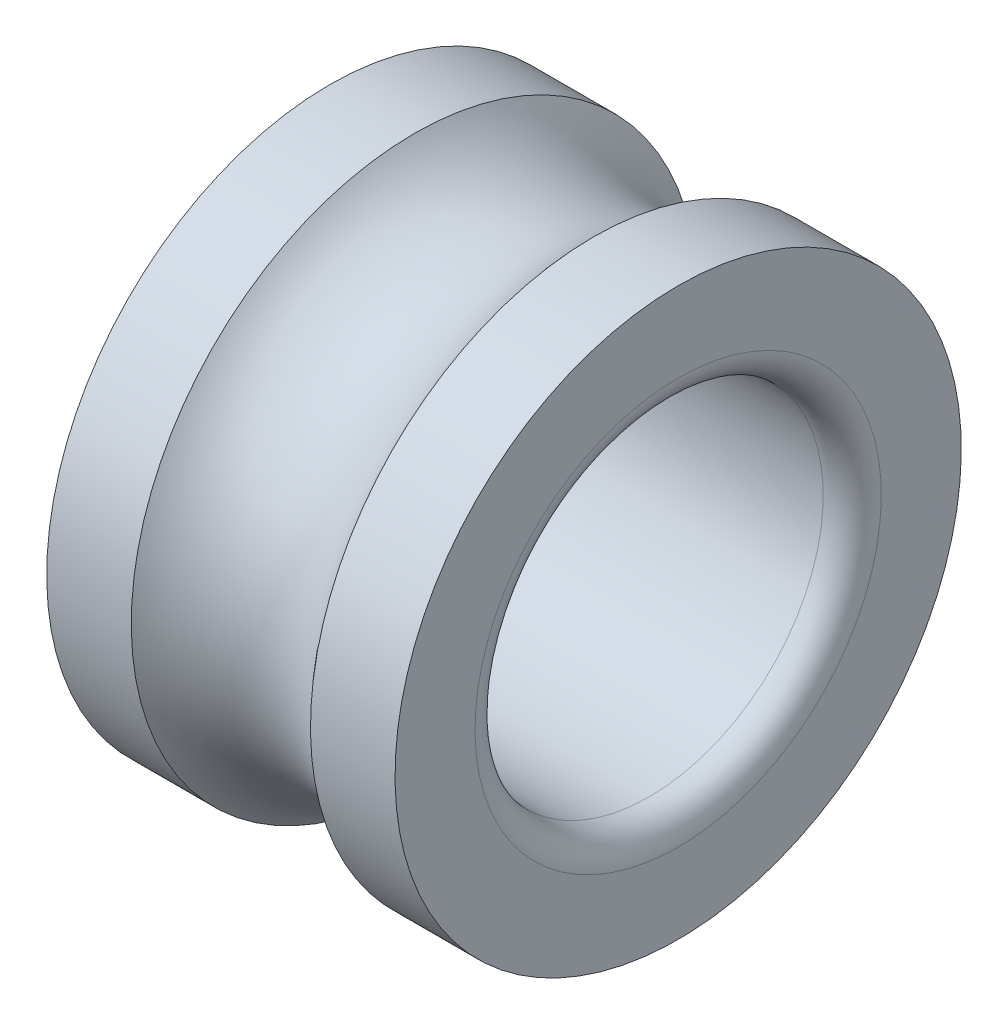
ISO-10303-21;
HEADER;
FILE_DESCRIPTION(('STEP AP214'),'2;1');
FILE_NAME('part.step','',(''),(''),'','','');
FILE_SCHEMA(('AUTOMOTIVE_DESIGN { 1 0 10303 214 1 1 1 1 }'));
ENDSEC;
DATA;
#1=APPLICATION_CONTEXT('core data for automotive mechanical design processes');
#2=APPLICATION_PROTOCOL_DEFINITION('international standard','automotive_design',2000,#1);
#3=PRODUCT_CONTEXT('',#1,'mechanical');
#4=PRODUCT('Part','Part','',(#3));
#5=PRODUCT_RELATED_PRODUCT_CATEGORY('part','',(#4));
#6=PRODUCT_DEFINITION_FORMATION('','',#4);
#7=PRODUCT_DEFINITION_CONTEXT('part definition',#1,'design');
#8=PRODUCT_DEFINITION('design','',#6,#7);
#9=PRODUCT_DEFINITION_SHAPE('','',#8);
#10=(LENGTH_UNIT() NAMED_UNIT(*) SI_UNIT(.MILLI.,.METRE.));
#11=(NAMED_UNIT(*) PLANE_ANGLE_UNIT() SI_UNIT($,.RADIAN.));
#12=(NAMED_UNIT(*) SI_UNIT($,.STERADIAN.) SOLID_ANGLE_UNIT());
#13=UNCERTAINTY_MEASURE_WITH_UNIT(LENGTH_MEASURE(1.E-05),#10,'distance_accuracy_value','');
#14=(GEOMETRIC_REPRESENTATION_CONTEXT(3) GLOBAL_UNCERTAINTY_ASSIGNED_CONTEXT((#13)) GLOBAL_UNIT_ASSIGNED_CONTEXT((#10,
#11,#12)) REPRESENTATION_CONTEXT('',''));
#15=CARTESIAN_POINT('',(0.,0.,0.));
#16=DIRECTION('',(0.,0.,1.));
#17=DIRECTION('',(1.,0.,0.));
#18=AXIS2_PLACEMENT_3D('',#15,#16,#17);
#19=CARTESIAN_POINT('',(10.5433677461966,0.,0.));
#20=DIRECTION('',(-1.,0.,0.));
#21=DIRECTION('',(0.,1.,0.));
#22=AXIS2_PLACEMENT_3D('',#19,#20,#21);
#23=CYLINDRICAL_SURFACE('',#22,9.755);
#24=CARTESIAN_POINT('',(9.08673549239322,0.,0.));
#25=DIRECTION('',(1.,0.,0.));
#26=DIRECTION('',(0.,1.,0.));
#27=AXIS2_PLACEMENT_3D('',#24,#25,#26);
#28=CIRCLE('',#27,9.755);
#29=CARTESIAN_POINT('',(9.08673549239322,9.755,0.));
#30=VERTEX_POINT('',#29);
#31=EDGE_CURVE('E11',#30,#30,#28,.T.);
#32=ORIENTED_EDGE('',*,*,#31,.T.);
#33=EDGE_LOOP('',(#32));
#34=FACE_BOUND('',#33,.T.);
#35=CARTESIAN_POINT('',(12.,0.,0.));
#36=DIRECTION('',(1.,0.,0.));
#37=DIRECTION('',(0.,1.,0.));
#38=AXIS2_PLACEMENT_3D('',#35,#36,#37);
#39=CIRCLE('',#38,9.755);
#40=CARTESIAN_POINT('',(12.,9.755,0.));
#41=VERTEX_POINT('',#40);
#42=EDGE_CURVE('E50',#41,#41,#39,.T.);
#43=ORIENTED_EDGE('',*,*,#42,.F.);
#44=EDGE_LOOP('',(#43));
#45=FACE_BOUND('',#44,.T.);
#46=ADVANCED_FACE('F16',(#34,#45),#23,.T.);
#47=CARTESIAN_POINT('',(6.,0.,0.));
#48=DIRECTION('',(1.,0.,0.));
#49=DIRECTION('',(0.,0.,-1.));
#50=AXIS2_PLACEMENT_3D('',#47,#48,#49);
#51=TOROIDAL_SURFACE('',#50,12.25,3.969);
#52=CARTESIAN_POINT('',(2.91326450760678,0.,0.));
#53=DIRECTION('',(1.,0.,0.));
#54=DIRECTION('',(0.,1.,0.));
#55=AXIS2_PLACEMENT_3D('',#52,#53,#54);
#56=CIRCLE('',#55,9.755);
#57=CARTESIAN_POINT('',(2.91326450760678,9.755,0.));
#58=VERTEX_POINT('',#57);
#59=EDGE_CURVE('E20',#58,#58,#56,.T.);
#60=ORIENTED_EDGE('',*,*,#59,.T.);
#61=EDGE_LOOP('',(#60));
#62=FACE_BOUND('',#61,.T.);
#63=ORIENTED_EDGE('',*,*,#31,.F.);
#64=EDGE_LOOP('',(#63));
#65=FACE_BOUND('',#64,.T.);
#66=ADVANCED_FACE('F95',(#62,#65),#51,.F.);
#67=CARTESIAN_POINT('',(1.45663225380339,0.,0.));
#68=DIRECTION('',(-1.,0.,0.));
#69=DIRECTION('',(0.,1.,0.));
#70=AXIS2_PLACEMENT_3D('',#67,#68,#69);
#71=CYLINDRICAL_SURFACE('',#70,9.755);
#72=CARTESIAN_POINT('',(0.,0.,0.));
#73=DIRECTION('',(1.,0.,0.));
#74=DIRECTION('',(0.,1.,0.));
#75=AXIS2_PLACEMENT_3D('',#72,#73,#74);
#76=CIRCLE('',#75,9.755);
#77=CARTESIAN_POINT('',(0.,9.755,0.));
#78=VERTEX_POINT('',#77);
#79=EDGE_CURVE('E56',#78,#78,#76,.T.);
#80=ORIENTED_EDGE('',*,*,#79,.T.);
#81=EDGE_LOOP('',(#80));
#82=FACE_BOUND('',#81,.T.);
#83=ORIENTED_EDGE('',*,*,#59,.F.);
#84=EDGE_LOOP('',(#83));
#85=FACE_BOUND('',#84,.T.);
#86=ADVANCED_FACE('F18',(#82,#85),#71,.T.);
#87=CARTESIAN_POINT('',(0.,8.3775,0.));
#88=DIRECTION('',(-1.,0.,0.));
#89=DIRECTION('',(0.,-1.,0.));
#90=AXIS2_PLACEMENT_3D('',#87,#88,#89);
#91=PLANE('',#90);
#92=CARTESIAN_POINT('',(0.,0.,0.));
#93=DIRECTION('',(1.,0.,0.));
#94=DIRECTION('',(0.,1.,0.));
#95=AXIS2_PLACEMENT_3D('',#92,#93,#94);
#96=CIRCLE('',#95,7.);
#97=CARTESIAN_POINT('',(0.,7.,0.));
#98=VERTEX_POINT('',#97);
#99=EDGE_CURVE('E60',#98,#98,#96,.T.);
#100=ORIENTED_EDGE('',*,*,#99,.T.);
#101=EDGE_LOOP('',(#100));
#102=FACE_BOUND('',#101,.T.);
#103=ORIENTED_EDGE('',*,*,#79,.F.);
#104=EDGE_LOOP('',(#103));
#105=FACE_BOUND('',#104,.T.);
#106=ADVANCED_FACE('F91',(#102,#105),#91,.T.);
#107=CARTESIAN_POINT('',(1.,0.,0.));
#108=DIRECTION('',(1.,0.,0.));
#109=DIRECTION('',(0.,0.,-1.));
#110=AXIS2_PLACEMENT_3D('',#107,#108,#109);
#111=TOROIDAL_SURFACE('',#110,7.,1.);
#112=CARTESIAN_POINT('',(1.,0.,0.));
#113=DIRECTION('',(1.,0.,0.));
#114=DIRECTION('',(0.,1.,0.));
#115=AXIS2_PLACEMENT_3D('',#112,#113,#114);
#116=CIRCLE('',#115,6.);
#117=CARTESIAN_POINT('',(1.,6.,0.));
#118=VERTEX_POINT('',#117);
#119=EDGE_CURVE('E66',#118,#118,#116,.T.);
#120=ORIENTED_EDGE('',*,*,#119,.T.);
#121=EDGE_LOOP('',(#120));
#122=FACE_BOUND('',#121,.T.);
#123=ORIENTED_EDGE('',*,*,#99,.F.);
#124=EDGE_LOOP('',(#123));
#125=FACE_BOUND('',#124,.T.);
#126=ADVANCED_FACE('F77',(#122,#125),#111,.T.);
#127=CARTESIAN_POINT('',(6.,0.,0.));
#128=DIRECTION('',(-1.,0.,0.));
#129=DIRECTION('',(0.,1.,0.));
#130=AXIS2_PLACEMENT_3D('',#127,#128,#129);
#131=CYLINDRICAL_SURFACE('',#130,6.);
#132=CARTESIAN_POINT('',(11.,0.,0.));
#133=DIRECTION('',(1.,0.,0.));
#134=DIRECTION('',(0.,1.,0.));
#135=AXIS2_PLACEMENT_3D('',#132,#133,#134);
#136=CIRCLE('',#135,6.);
#137=CARTESIAN_POINT('',(11.,6.,0.));
#138=VERTEX_POINT('',#137);
#139=EDGE_CURVE('E70',#138,#138,#136,.T.);
#140=ORIENTED_EDGE('',*,*,#139,.T.);
#141=EDGE_LOOP('',(#140));
#142=FACE_BOUND('',#141,.T.);
#143=ORIENTED_EDGE('',*,*,#119,.F.);
#144=EDGE_LOOP('',(#143));
#145=FACE_BOUND('',#144,.T.);
#146=ADVANCED_FACE('F80',(#142,#145),#131,.F.);
#147=CARTESIAN_POINT('',(11.,0.,0.));
#148=DIRECTION('',(1.,0.,0.));
#149=DIRECTION('',(0.,0.,-1.));
#150=AXIS2_PLACEMENT_3D('',#147,#148,#149);
#151=TOROIDAL_SURFACE('',#150,7.,1.);
#152=CARTESIAN_POINT('',(12.,0.,0.));
#153=DIRECTION('',(1.,0.,0.));
#154=DIRECTION('',(0.,1.,0.));
#155=AXIS2_PLACEMENT_3D('',#152,#153,#154);
#156=CIRCLE('',#155,7.);
#157=CARTESIAN_POINT('',(12.,7.,0.));
#158=VERTEX_POINT('',#157);
#159=EDGE_CURVE('E46',#158,#158,#156,.T.);
#160=ORIENTED_EDGE('',*,*,#159,.T.);
#161=EDGE_LOOP('',(#160));
#162=FACE_BOUND('',#161,.T.);
#163=ORIENTED_EDGE('',*,*,#139,.F.);
#164=EDGE_LOOP('',(#163));
#165=FACE_BOUND('',#164,.T.);
#166=ADVANCED_FACE('F82',(#162,#165),#151,.T.);
#167=CARTESIAN_POINT('',(12.,8.3775,0.));
#168=DIRECTION('',(1.,0.,0.));
#169=DIRECTION('',(0.,1.,0.));
#170=AXIS2_PLACEMENT_3D('',#167,#168,#169);
#171=PLANE('',#170);
#172=ORIENTED_EDGE('',*,*,#42,.T.);
#173=EDGE_LOOP('',(#172));
#174=FACE_BOUND('',#173,.T.);
#175=ORIENTED_EDGE('',*,*,#159,.F.);
#176=EDGE_LOOP('',(#175));
#177=FACE_BOUND('',#176,.T.);
#178=ADVANCED_FACE('F89',(#174,#177),#171,.T.);
#179=CLOSED_SHELL('',(#46,#66,#86,#106,#126,#146,#166,#178));
#180=MANIFOLD_SOLID_BREP('B1',#179);
#181=ADVANCED_BREP_SHAPE_REPRESENTATION('',(#18,#180),#14);
#182=SHAPE_DEFINITION_REPRESENTATION(#9,#181);
ENDSEC;
END-ISO-10303-21;
